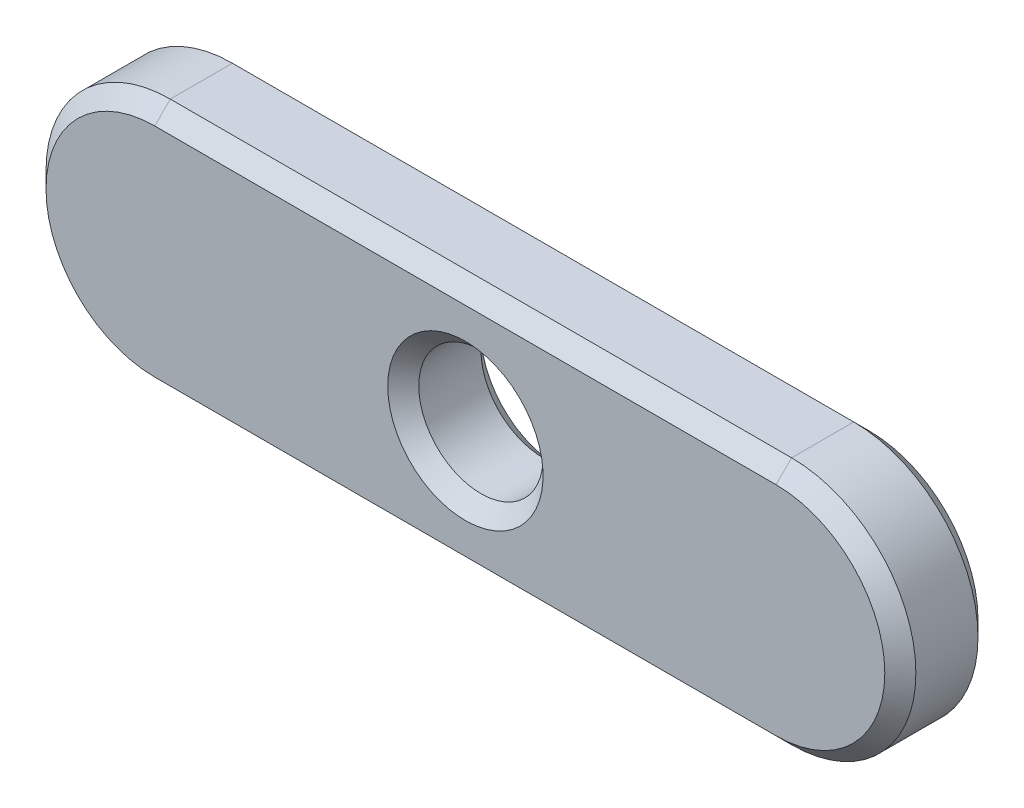
ISO-10303-21;
HEADER;
FILE_DESCRIPTION(('STEP AP214'),'2;1');
FILE_NAME('part.step','',(''),(''),'','','');
FILE_SCHEMA(('AUTOMOTIVE_DESIGN { 1 0 10303 214 1 1 1 1 }'));
ENDSEC;
DATA;
#1=APPLICATION_CONTEXT('core data for automotive mechanical design processes');
#2=APPLICATION_PROTOCOL_DEFINITION('international standard','automotive_design',2000,#1);
#3=PRODUCT_CONTEXT('',#1,'mechanical');
#4=PRODUCT('Part','Part','',(#3));
#5=PRODUCT_RELATED_PRODUCT_CATEGORY('part','',(#4));
#6=PRODUCT_DEFINITION_FORMATION('','',#4);
#7=PRODUCT_DEFINITION_CONTEXT('part definition',#1,'design');
#8=PRODUCT_DEFINITION('design','',#6,#7);
#9=PRODUCT_DEFINITION_SHAPE('','',#8);
#10=(LENGTH_UNIT() NAMED_UNIT(*) SI_UNIT(.MILLI.,.METRE.));
#11=(NAMED_UNIT(*) PLANE_ANGLE_UNIT() SI_UNIT($,.RADIAN.));
#12=(NAMED_UNIT(*) SI_UNIT($,.STERADIAN.) SOLID_ANGLE_UNIT());
#13=UNCERTAINTY_MEASURE_WITH_UNIT(LENGTH_MEASURE(1.E-05),#10,'distance_accuracy_value','');
#14=(GEOMETRIC_REPRESENTATION_CONTEXT(3) GLOBAL_UNCERTAINTY_ASSIGNED_CONTEXT((#13)) GLOBAL_UNIT_ASSIGNED_CONTEXT((#10,
#11,#12)) REPRESENTATION_CONTEXT('',''));
#15=CARTESIAN_POINT('',(0.,0.,0.));
#16=DIRECTION('',(0.,0.,1.));
#17=DIRECTION('',(1.,0.,0.));
#18=AXIS2_PLACEMENT_3D('',#15,#16,#17);
#19=CARTESIAN_POINT('',(10.,0.,3.));
#20=DIRECTION('',(0.,0.,-1.));
#21=DIRECTION('',(-1.,0.,0.));
#22=AXIS2_PLACEMENT_3D('',#19,#20,#21);
#23=CYLINDRICAL_SURFACE('',#22,4.);
#24=DIRECTION('',(0.,0.,-1.));
#25=VECTOR('',#24,1.);
#26=CARTESIAN_POINT('',(10.,4.00000000000002,3.));
#27=LINE('',#26,#25);
#28=CARTESIAN_POINT('',(10.,3.99999999999999,2.49999999999999));
#29=VERTEX_POINT('',#28);
#30=CARTESIAN_POINT('',(10.,3.99999999999999,0.5));
#31=VERTEX_POINT('',#30);
#32=EDGE_CURVE('E191',#29,#31,#27,.T.);
#33=ORIENTED_EDGE('',*,*,#32,.F.);
#34=CARTESIAN_POINT('',(10.,0.,2.49999999999999));
#35=DIRECTION('',(0.,0.,-1.));
#36=DIRECTION('',(-1.,0.,0.));
#37=AXIS2_PLACEMENT_3D('',#34,#35,#36);
#38=CIRCLE('',#37,4.);
#39=CARTESIAN_POINT('',(10.,-4.,2.49999999999999));
#40=VERTEX_POINT('',#39);
#41=EDGE_CURVE('E142',#29,#40,#38,.T.);
#42=ORIENTED_EDGE('',*,*,#41,.T.);
#43=DIRECTION('',(0.,0.,-1.));
#44=VECTOR('',#43,1.);
#45=CARTESIAN_POINT('',(10.,-4.,3.));
#46=LINE('',#45,#44);
#47=CARTESIAN_POINT('',(10.,-4.,0.500000000000007));
#48=VERTEX_POINT('',#47);
#49=EDGE_CURVE('E182',#40,#48,#46,.T.);
#50=ORIENTED_EDGE('',*,*,#49,.T.);
#51=CARTESIAN_POINT('',(10.,0.,0.500000000000007));
#52=DIRECTION('',(0.,0.,-1.));
#53=DIRECTION('',(-1.,0.,0.));
#54=AXIS2_PLACEMENT_3D('',#51,#52,#53);
#55=CIRCLE('',#54,4.);
#56=EDGE_CURVE('E140',#48,#31,#55,.F.);
#57=ORIENTED_EDGE('',*,*,#56,.T.);
#58=EDGE_LOOP('',(#33,#42,#50,#57));
#59=FACE_BOUND('',#58,.T.);
#60=ADVANCED_FACE('F33',(#59),#23,.T.);
#61=CARTESIAN_POINT('',(-10.,4.00000000000002,3.));
#62=DIRECTION('',(0.,1.,0.));
#63=DIRECTION('',(0.,0.,1.));
#64=AXIS2_PLACEMENT_3D('',#61,#62,#63);
#65=PLANE('',#64);
#66=DIRECTION('',(0.,0.,-1.));
#67=VECTOR('',#66,1.);
#68=CARTESIAN_POINT('',(-10.,4.00000000000002,3.));
#69=LINE('',#68,#67);
#70=CARTESIAN_POINT('',(-10.,3.99999999999999,2.49999999999999));
#71=VERTEX_POINT('',#70);
#72=CARTESIAN_POINT('',(-10.,3.99999999999999,0.500000000000007));
#73=VERTEX_POINT('',#72);
#74=EDGE_CURVE('E188',#71,#73,#69,.T.);
#75=ORIENTED_EDGE('',*,*,#74,.F.);
#76=DIRECTION('',(1.,0.,0.));
#77=VECTOR('',#76,1.);
#78=CARTESIAN_POINT('',(10.,3.99999999999999,2.49999999999999));
#79=LINE('',#78,#77);
#80=EDGE_CURVE('E138',#71,#29,#79,.T.);
#81=ORIENTED_EDGE('',*,*,#80,.T.);
#82=ORIENTED_EDGE('',*,*,#32,.T.);
#83=DIRECTION('',(-1.,0.,0.));
#84=VECTOR('',#83,1.);
#85=CARTESIAN_POINT('',(-10.,3.99999999999999,0.5));
#86=LINE('',#85,#84);
#87=EDGE_CURVE('E135',#31,#73,#86,.T.);
#88=ORIENTED_EDGE('',*,*,#87,.T.);
#89=EDGE_LOOP('',(#75,#81,#82,#88));
#90=FACE_BOUND('',#89,.T.);
#91=ADVANCED_FACE('F35',(#90),#65,.T.);
#92=CARTESIAN_POINT('',(-10.,0.,3.));
#93=DIRECTION('',(0.,0.,-1.));
#94=DIRECTION('',(-1.,0.,0.));
#95=AXIS2_PLACEMENT_3D('',#92,#93,#94);
#96=CYLINDRICAL_SURFACE('',#95,4.);
#97=DIRECTION('',(0.,0.,-1.));
#98=VECTOR('',#97,1.);
#99=CARTESIAN_POINT('',(-10.,-4.,3.));
#100=LINE('',#99,#98);
#101=CARTESIAN_POINT('',(-10.,-3.99999999999999,2.5));
#102=VERTEX_POINT('',#101);
#103=CARTESIAN_POINT('',(-10.,-4.,0.500000000000014));
#104=VERTEX_POINT('',#103);
#105=EDGE_CURVE('E185',#102,#104,#100,.T.);
#106=ORIENTED_EDGE('',*,*,#105,.F.);
#107=CARTESIAN_POINT('',(-10.,0.,2.5));
#108=DIRECTION('',(0.,0.,-1.));
#109=DIRECTION('',(-1.,0.,0.));
#110=AXIS2_PLACEMENT_3D('',#107,#108,#109);
#111=CIRCLE('',#110,4.);
#112=EDGE_CURVE('E133',#102,#71,#111,.T.);
#113=ORIENTED_EDGE('',*,*,#112,.T.);
#114=ORIENTED_EDGE('',*,*,#74,.T.);
#115=CARTESIAN_POINT('',(-10.,0.,0.500000000000007));
#116=DIRECTION('',(0.,0.,-1.));
#117=DIRECTION('',(-1.,0.,0.));
#118=AXIS2_PLACEMENT_3D('',#115,#116,#117);
#119=CIRCLE('',#118,4.);
#120=EDGE_CURVE('E131',#73,#104,#119,.F.);
#121=ORIENTED_EDGE('',*,*,#120,.T.);
#122=EDGE_LOOP('',(#106,#113,#114,#121));
#123=FACE_BOUND('',#122,.T.);
#124=ADVANCED_FACE('F208',(#123),#96,.T.);
#125=CARTESIAN_POINT('',(-10.,-4.,3.));
#126=DIRECTION('',(0.,1.,0.));
#127=DIRECTION('',(-1.,0.,0.));
#128=AXIS2_PLACEMENT_3D('',#125,#126,#127);
#129=PLANE('',#128);
#130=ORIENTED_EDGE('',*,*,#49,.F.);
#131=DIRECTION('',(-1.,0.,0.));
#132=VECTOR('',#131,1.);
#133=CARTESIAN_POINT('',(-10.,-3.99999999999999,2.5));
#134=LINE('',#133,#132);
#135=EDGE_CURVE('E103',#40,#102,#134,.T.);
#136=ORIENTED_EDGE('',*,*,#135,.T.);
#137=ORIENTED_EDGE('',*,*,#105,.T.);
#138=DIRECTION('',(1.,0.,0.));
#139=VECTOR('',#138,1.);
#140=CARTESIAN_POINT('',(10.,-4.,0.500000000000014));
#141=LINE('',#140,#139);
#142=EDGE_CURVE('E124',#104,#48,#141,.T.);
#143=ORIENTED_EDGE('',*,*,#142,.T.);
#144=EDGE_LOOP('',(#130,#136,#137,#143));
#145=FACE_BOUND('',#144,.T.);
#146=ADVANCED_FACE('F207',(#145),#129,.F.);
#147=CARTESIAN_POINT('',(10.,0.,3.));
#148=DIRECTION('',(0.,0.,-1.));
#149=DIRECTION('',(-1.,0.,0.));
#150=AXIS2_PLACEMENT_3D('',#147,#148,#149);
#151=PLANE('',#150);
#152=CARTESIAN_POINT('',(-10.,0.,3.));
#153=DIRECTION('',(0.,0.,-1.));
#154=DIRECTION('',(-1.,0.,0.));
#155=AXIS2_PLACEMENT_3D('',#152,#153,#154);
#156=CIRCLE('',#155,3.49999999999999);
#157=CARTESIAN_POINT('',(-10.,3.49999999999999,3.));
#158=VERTEX_POINT('',#157);
#159=CARTESIAN_POINT('',(-10.,-3.49999999999999,3.));
#160=VERTEX_POINT('',#159);
#161=EDGE_CURVE('E122',#158,#160,#156,.F.);
#162=ORIENTED_EDGE('',*,*,#161,.T.);
#163=DIRECTION('',(1.,0.,0.));
#164=VECTOR('',#163,1.);
#165=CARTESIAN_POINT('',(10.,-3.49999999999999,3.));
#166=LINE('',#165,#164);
#167=CARTESIAN_POINT('',(10.,-3.5,3.));
#168=VERTEX_POINT('',#167);
#169=EDGE_CURVE('E101',#160,#168,#166,.T.);
#170=ORIENTED_EDGE('',*,*,#169,.T.);
#171=CARTESIAN_POINT('',(10.,0.,3.));
#172=DIRECTION('',(0.,0.,-1.));
#173=DIRECTION('',(-1.,0.,0.));
#174=AXIS2_PLACEMENT_3D('',#171,#172,#173);
#175=CIRCLE('',#174,3.5);
#176=CARTESIAN_POINT('',(10.,3.49999999999999,3.));
#177=VERTEX_POINT('',#176);
#178=EDGE_CURVE('E110',#168,#177,#175,.F.);
#179=ORIENTED_EDGE('',*,*,#178,.T.);
#180=DIRECTION('',(-1.,0.,0.));
#181=VECTOR('',#180,1.);
#182=CARTESIAN_POINT('',(-10.,3.49999999999999,3.));
#183=LINE('',#182,#181);
#184=EDGE_CURVE('E116',#177,#158,#183,.T.);
#185=ORIENTED_EDGE('',*,*,#184,.T.);
#186=EDGE_LOOP('',(#162,#170,#179,#185));
#187=FACE_BOUND('',#186,.T.);
#188=CARTESIAN_POINT('',(0.,0.,3.));
#189=DIRECTION('',(0.,0.,-1.));
#190=DIRECTION('',(-1.,0.,0.));
#191=AXIS2_PLACEMENT_3D('',#188,#189,#190);
#192=CIRCLE('',#191,2.5);
#193=CARTESIAN_POINT('',(-2.5,0.,3.));
#194=VERTEX_POINT('',#193);
#195=EDGE_CURVE('E117',#194,#194,#192,.T.);
#196=ORIENTED_EDGE('',*,*,#195,.T.);
#197=EDGE_LOOP('',(#196));
#198=FACE_BOUND('',#197,.T.);
#199=ADVANCED_FACE('F119',(#187,#198),#151,.F.);
#200=CARTESIAN_POINT('',(10.,0.,0.));
#201=DIRECTION('',(0.,0.,-1.));
#202=DIRECTION('',(-1.,0.,0.));
#203=AXIS2_PLACEMENT_3D('',#200,#201,#202);
#204=PLANE('',#203);
#205=CARTESIAN_POINT('',(-10.,0.,0.));
#206=DIRECTION('',(0.,0.,-1.));
#207=DIRECTION('',(-1.,0.,0.));
#208=AXIS2_PLACEMENT_3D('',#205,#206,#207);
#209=CIRCLE('',#208,3.5);
#210=CARTESIAN_POINT('',(-10.,-3.5,0.));
#211=VERTEX_POINT('',#210);
#212=CARTESIAN_POINT('',(-10.,3.49999999999999,0.));
#213=VERTEX_POINT('',#212);
#214=EDGE_CURVE('E41',#211,#213,#209,.T.);
#215=ORIENTED_EDGE('',*,*,#214,.T.);
#216=DIRECTION('',(1.,0.,0.));
#217=VECTOR('',#216,1.);
#218=CARTESIAN_POINT('',(10.,3.49999999999999,0.));
#219=LINE('',#218,#217);
#220=CARTESIAN_POINT('',(10.,3.49999999999999,0.));
#221=VERTEX_POINT('',#220);
#222=EDGE_CURVE('E11',#213,#221,#219,.T.);
#223=ORIENTED_EDGE('',*,*,#222,.T.);
#224=CARTESIAN_POINT('',(10.,0.,0.));
#225=DIRECTION('',(0.,0.,-1.));
#226=DIRECTION('',(-1.,0.,0.));
#227=AXIS2_PLACEMENT_3D('',#224,#225,#226);
#228=CIRCLE('',#227,3.49999999999999);
#229=CARTESIAN_POINT('',(10.,-3.49999999999999,0.));
#230=VERTEX_POINT('',#229);
#231=EDGE_CURVE('E153',#221,#230,#228,.T.);
#232=ORIENTED_EDGE('',*,*,#231,.T.);
#233=DIRECTION('',(-1.,0.,0.));
#234=VECTOR('',#233,1.);
#235=CARTESIAN_POINT('',(-10.,-3.5,0.));
#236=LINE('',#235,#234);
#237=EDGE_CURVE('E51',#230,#211,#236,.T.);
#238=ORIENTED_EDGE('',*,*,#237,.T.);
#239=EDGE_LOOP('',(#215,#223,#232,#238));
#240=FACE_BOUND('',#239,.T.);
#241=CARTESIAN_POINT('',(0.,0.,0.));
#242=DIRECTION('',(0.,0.,-1.));
#243=DIRECTION('',(-1.,0.,0.));
#244=AXIS2_PLACEMENT_3D('',#241,#242,#243);
#245=CIRCLE('',#244,2.50000000000001);
#246=CARTESIAN_POINT('',(-2.50000000000001,0.,0.));
#247=VERTEX_POINT('',#246);
#248=EDGE_CURVE('E150',#247,#247,#245,.F.);
#249=ORIENTED_EDGE('',*,*,#248,.T.);
#250=EDGE_LOOP('',(#249));
#251=FACE_BOUND('',#250,.T.);
#252=ADVANCED_FACE('F156',(#240,#251),#204,.T.);
#253=CARTESIAN_POINT('',(0.,0.,0.));
#254=DIRECTION('',(0.,0.,1.));
#255=DIRECTION('',(1.,0.,0.));
#256=AXIS2_PLACEMENT_3D('',#253,#254,#255);
#257=CYLINDRICAL_SURFACE('',#256,2.);
#258=CARTESIAN_POINT('',(0.,0.,2.49999999999999));
#259=DIRECTION('',(0.,0.,-1.));
#260=DIRECTION('',(-1.,0.,0.));
#261=AXIS2_PLACEMENT_3D('',#258,#259,#260);
#262=CIRCLE('',#261,2.);
#263=CARTESIAN_POINT('',(-2.,0.,2.49999999999999));
#264=VERTEX_POINT('',#263);
#265=EDGE_CURVE('E147',#264,#264,#262,.F.);
#266=ORIENTED_EDGE('',*,*,#265,.T.);
#267=EDGE_LOOP('',(#266));
#268=FACE_BOUND('',#267,.T.);
#269=CARTESIAN_POINT('',(0.,0.,0.500000000000007));
#270=DIRECTION('',(0.,0.,-1.));
#271=DIRECTION('',(-1.,0.,0.));
#272=AXIS2_PLACEMENT_3D('',#269,#270,#271);
#273=CIRCLE('',#272,2.);
#274=CARTESIAN_POINT('',(-2.,0.,0.500000000000007));
#275=VERTEX_POINT('',#274);
#276=EDGE_CURVE('E144',#275,#275,#273,.T.);
#277=ORIENTED_EDGE('',*,*,#276,.T.);
#278=EDGE_LOOP('',(#277));
#279=FACE_BOUND('',#278,.T.);
#280=ADVANCED_FACE('F244',(#268,#279),#257,.F.);
#281=CARTESIAN_POINT('',(-10.,3.99999999999999,2.49999999999999));
#282=DIRECTION('',(0.,0.707106781186551,0.707106781186544));
#283=DIRECTION('',(0.,-0.707106781186544,0.707106781186551));
#284=AXIS2_PLACEMENT_3D('',#281,#282,#283);
#285=PLANE('',#284);
#286=DIRECTION('',(0.,-0.707106781186544,0.707106781186551));
#287=VECTOR('',#286,1.);
#288=CARTESIAN_POINT('',(10.,3.99999999999999,2.49999999999999));
#289=LINE('',#288,#287);
#290=EDGE_CURVE('E113',#29,#177,#289,.T.);
#291=ORIENTED_EDGE('',*,*,#290,.F.);
#292=ORIENTED_EDGE('',*,*,#80,.F.);
#293=DIRECTION('',(0.,0.707106781186544,-0.707106781186551));
#294=VECTOR('',#293,1.);
#295=CARTESIAN_POINT('',(-10.,3.49999999999999,3.));
#296=LINE('',#295,#294);
#297=EDGE_CURVE('E179',#158,#71,#296,.T.);
#298=ORIENTED_EDGE('',*,*,#297,.F.);
#299=ORIENTED_EDGE('',*,*,#184,.F.);
#300=EDGE_LOOP('',(#291,#292,#298,#299));
#301=FACE_BOUND('',#300,.T.);
#302=ADVANCED_FACE('F198',(#301),#285,.T.);
#303=CARTESIAN_POINT('',(-10.,0.,3.));
#304=DIRECTION('',(0.,0.,-1.));
#305=DIRECTION('',(-1.,0.,0.));
#306=AXIS2_PLACEMENT_3D('',#303,#304,#305);
#307=CONICAL_SURFACE('',#306,3.49999999999999,0.785398163397453);
#308=ORIENTED_EDGE('',*,*,#297,.T.);
#309=ORIENTED_EDGE('',*,*,#112,.F.);
#310=DIRECTION('',(0.,-0.707106781186551,-0.707106781186544));
#311=VECTOR('',#310,1.);
#312=CARTESIAN_POINT('',(-10.,-3.49999999999999,3.));
#313=LINE('',#312,#311);
#314=EDGE_CURVE('E106',#160,#102,#313,.T.);
#315=ORIENTED_EDGE('',*,*,#314,.F.);
#316=ORIENTED_EDGE('',*,*,#161,.F.);
#317=EDGE_LOOP('',(#308,#309,#315,#316));
#318=FACE_BOUND('',#317,.T.);
#319=ADVANCED_FACE('F201',(#318),#307,.T.);
#320=CARTESIAN_POINT('',(10.,0.,2.49999999999999));
#321=DIRECTION('',(0.,0.,-1.));
#322=DIRECTION('',(-1.,0.,0.));
#323=AXIS2_PLACEMENT_3D('',#320,#321,#322);
#324=CONICAL_SURFACE('',#323,4.,0.785398163397443);
#325=ORIENTED_EDGE('',*,*,#290,.T.);
#326=ORIENTED_EDGE('',*,*,#178,.F.);
#327=DIRECTION('',(0.,0.707106781186544,0.707106781186551));
#328=VECTOR('',#327,1.);
#329=CARTESIAN_POINT('',(10.,-4.,2.49999999999999));
#330=LINE('',#329,#328);
#331=EDGE_CURVE('E97',#40,#168,#330,.T.);
#332=ORIENTED_EDGE('',*,*,#331,.F.);
#333=ORIENTED_EDGE('',*,*,#41,.F.);
#334=EDGE_LOOP('',(#325,#326,#332,#333));
#335=FACE_BOUND('',#334,.T.);
#336=ADVANCED_FACE('F111',(#335),#324,.T.);
#337=CARTESIAN_POINT('',(10.,-3.49999999999999,3.));
#338=DIRECTION('',(0.,0.707106781186544,-0.707106781186551));
#339=DIRECTION('',(0.,0.707106781186551,0.707106781186544));
#340=AXIS2_PLACEMENT_3D('',#337,#338,#339);
#341=PLANE('',#340);
#342=ORIENTED_EDGE('',*,*,#314,.T.);
#343=ORIENTED_EDGE('',*,*,#135,.F.);
#344=ORIENTED_EDGE('',*,*,#331,.T.);
#345=ORIENTED_EDGE('',*,*,#169,.F.);
#346=EDGE_LOOP('',(#342,#343,#344,#345));
#347=FACE_BOUND('',#346,.T.);
#348=ADVANCED_FACE('F99',(#347),#341,.F.);
#349=CARTESIAN_POINT('',(0.,0.,2.49999999999999));
#350=DIRECTION('',(0.,0.,1.));
#351=DIRECTION('',(1.,0.,0.));
#352=AXIS2_PLACEMENT_3D('',#349,#350,#351);
#353=CONICAL_SURFACE('',#352,2.,0.785398163397443);
#354=ORIENTED_EDGE('',*,*,#195,.F.);
#355=EDGE_LOOP('',(#354));
#356=FACE_BOUND('',#355,.T.);
#357=ORIENTED_EDGE('',*,*,#265,.F.);
#358=EDGE_LOOP('',(#357));
#359=FACE_BOUND('',#358,.T.);
#360=ADVANCED_FACE('F259',(#356,#359),#353,.F.);
#361=CARTESIAN_POINT('',(-10.,-4.,0.500000000000014));
#362=DIRECTION('',(0.,-0.707106781186551,-0.707106781186544));
#363=DIRECTION('',(0.,0.707106781186544,-0.707106781186551));
#364=AXIS2_PLACEMENT_3D('',#361,#362,#363);
#365=PLANE('',#364);
#366=DIRECTION('',(0.,0.707106781186544,-0.707106781186551));
#367=VECTOR('',#366,1.);
#368=CARTESIAN_POINT('',(10.,-4.,0.500000000000014));
#369=LINE('',#368,#367);
#370=EDGE_CURVE('E166',#48,#230,#369,.T.);
#371=ORIENTED_EDGE('',*,*,#370,.F.);
#372=ORIENTED_EDGE('',*,*,#142,.F.);
#373=DIRECTION('',(0.,-0.707106781186544,0.707106781186551));
#374=VECTOR('',#373,1.);
#375=CARTESIAN_POINT('',(-10.,-3.5,0.));
#376=LINE('',#375,#374);
#377=EDGE_CURVE('E107',#211,#104,#376,.T.);
#378=ORIENTED_EDGE('',*,*,#377,.F.);
#379=ORIENTED_EDGE('',*,*,#237,.F.);
#380=EDGE_LOOP('',(#371,#372,#378,#379));
#381=FACE_BOUND('',#380,.T.);
#382=ADVANCED_FACE('F164',(#381),#365,.T.);
#383=CARTESIAN_POINT('',(-10.,0.,0.500000000000007));
#384=DIRECTION('',(0.,0.,1.));
#385=DIRECTION('',(1.,0.,0.));
#386=AXIS2_PLACEMENT_3D('',#383,#384,#385);
#387=CONICAL_SURFACE('',#386,4.,0.785398163397443);
#388=ORIENTED_EDGE('',*,*,#377,.T.);
#389=ORIENTED_EDGE('',*,*,#120,.F.);
#390=DIRECTION('',(0.,0.707106781186544,0.707106781186551));
#391=VECTOR('',#390,1.);
#392=CARTESIAN_POINT('',(-10.,3.49999999999999,0.));
#393=LINE('',#392,#391);
#394=EDGE_CURVE('E170',#213,#73,#393,.T.);
#395=ORIENTED_EDGE('',*,*,#394,.F.);
#396=ORIENTED_EDGE('',*,*,#214,.F.);
#397=EDGE_LOOP('',(#388,#389,#395,#396));
#398=FACE_BOUND('',#397,.T.);
#399=ADVANCED_FACE('F211',(#398),#387,.T.);
#400=CARTESIAN_POINT('',(10.,0.,0.));
#401=DIRECTION('',(0.,0.,1.));
#402=DIRECTION('',(1.,0.,0.));
#403=AXIS2_PLACEMENT_3D('',#400,#401,#402);
#404=CONICAL_SURFACE('',#403,3.49999999999999,0.785398163397453);
#405=ORIENTED_EDGE('',*,*,#370,.T.);
#406=ORIENTED_EDGE('',*,*,#231,.F.);
#407=DIRECTION('',(0.,-0.707106781186551,-0.707106781186544));
#408=VECTOR('',#407,1.);
#409=CARTESIAN_POINT('',(10.,3.99999999999999,0.5));
#410=LINE('',#409,#408);
#411=EDGE_CURVE('E173',#31,#221,#410,.T.);
#412=ORIENTED_EDGE('',*,*,#411,.F.);
#413=ORIENTED_EDGE('',*,*,#56,.F.);
#414=EDGE_LOOP('',(#405,#406,#412,#413));
#415=FACE_BOUND('',#414,.T.);
#416=ADVANCED_FACE('F169',(#415),#404,.T.);
#417=CARTESIAN_POINT('',(10.,3.49999999999999,0.));
#418=DIRECTION('',(0.,-0.707106781186544,0.707106781186551));
#419=DIRECTION('',(0.,-0.707106781186551,-0.707106781186544));
#420=AXIS2_PLACEMENT_3D('',#417,#418,#419);
#421=PLANE('',#420);
#422=ORIENTED_EDGE('',*,*,#394,.T.);
#423=ORIENTED_EDGE('',*,*,#87,.F.);
#424=ORIENTED_EDGE('',*,*,#411,.T.);
#425=ORIENTED_EDGE('',*,*,#222,.F.);
#426=EDGE_LOOP('',(#422,#423,#424,#425));
#427=FACE_BOUND('',#426,.T.);
#428=ADVANCED_FACE('F216',(#427),#421,.F.);
#429=CARTESIAN_POINT('',(0.,0.,0.));
#430=DIRECTION('',(0.,0.,-1.));
#431=DIRECTION('',(-1.,0.,0.));
#432=AXIS2_PLACEMENT_3D('',#429,#430,#431);
#433=CONICAL_SURFACE('',#432,2.50000000000001,0.785398163397453);
#434=ORIENTED_EDGE('',*,*,#276,.F.);
#435=EDGE_LOOP('',(#434));
#436=FACE_BOUND('',#435,.T.);
#437=ORIENTED_EDGE('',*,*,#248,.F.);
#438=EDGE_LOOP('',(#437));
#439=FACE_BOUND('',#438,.T.);
#440=ADVANCED_FACE('F218',(#436,#439),#433,.F.);
#441=CLOSED_SHELL('',(#60,#91,#124,#146,#199,#252,#280,#302,#319,#336,#348,#360,#382,#399,#416,
#428,#440));
#442=MANIFOLD_SOLID_BREP('B2',#441);
#443=ADVANCED_BREP_SHAPE_REPRESENTATION('',(#18,#442),#14);
#444=SHAPE_DEFINITION_REPRESENTATION(#9,#443);
ENDSEC;
END-ISO-10303-21;
